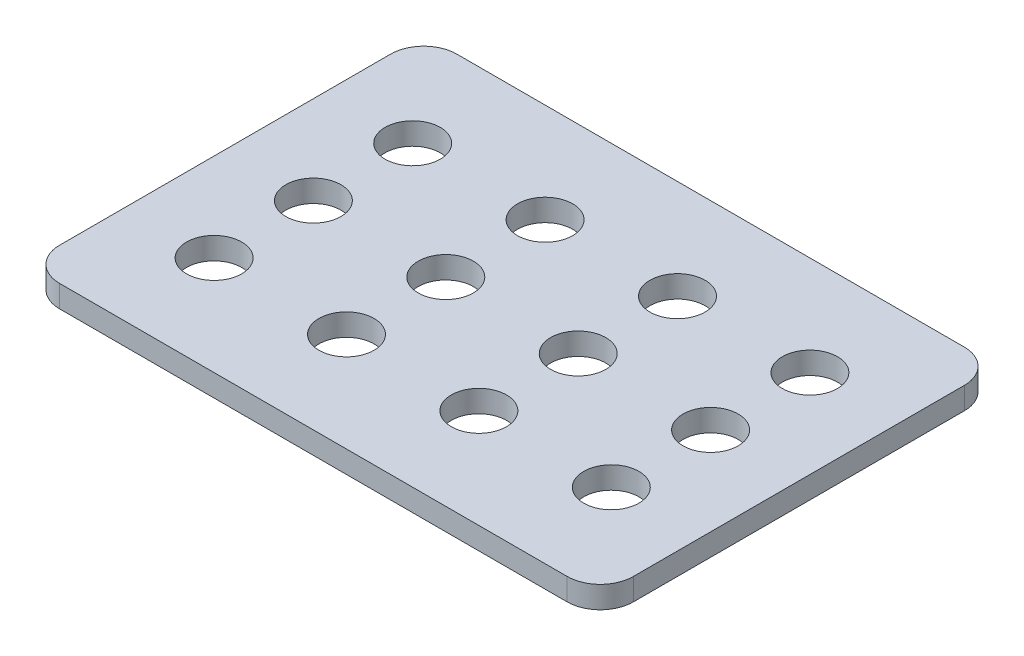
ISO-10303-21;
HEADER;
FILE_DESCRIPTION(('STEP AP214'),'2;1');
FILE_NAME('part.step','',(''),(''),'','','');
FILE_SCHEMA(('AUTOMOTIVE_DESIGN { 1 0 10303 214 1 1 1 1 }'));
ENDSEC;
DATA;
#1=APPLICATION_CONTEXT('core data for automotive mechanical design processes');
#2=APPLICATION_PROTOCOL_DEFINITION('international standard','automotive_design',2000,#1);
#3=PRODUCT_CONTEXT('',#1,'mechanical');
#4=PRODUCT('Part','Part','',(#3));
#5=PRODUCT_RELATED_PRODUCT_CATEGORY('part','',(#4));
#6=PRODUCT_DEFINITION_FORMATION('','',#4);
#7=PRODUCT_DEFINITION_CONTEXT('part definition',#1,'design');
#8=PRODUCT_DEFINITION('design','',#6,#7);
#9=PRODUCT_DEFINITION_SHAPE('','',#8);
#10=(LENGTH_UNIT() NAMED_UNIT(*) SI_UNIT(.MILLI.,.METRE.));
#11=(NAMED_UNIT(*) PLANE_ANGLE_UNIT() SI_UNIT($,.RADIAN.));
#12=(NAMED_UNIT(*) SI_UNIT($,.STERADIAN.) SOLID_ANGLE_UNIT());
#13=UNCERTAINTY_MEASURE_WITH_UNIT(LENGTH_MEASURE(1.E-05),#10,'distance_accuracy_value','');
#14=(GEOMETRIC_REPRESENTATION_CONTEXT(3) GLOBAL_UNCERTAINTY_ASSIGNED_CONTEXT((#13)) GLOBAL_UNIT_ASSIGNED_CONTEXT((#10,
#11,#12)) REPRESENTATION_CONTEXT('',''));
#15=CARTESIAN_POINT('',(0.,0.,0.));
#16=DIRECTION('',(0.,0.,1.));
#17=DIRECTION('',(1.,0.,0.));
#18=AXIS2_PLACEMENT_3D('',#15,#16,#17);
#19=CARTESIAN_POINT('',(245.,10.,-15.));
#20=DIRECTION('',(0.,1.,0.));
#21=DIRECTION('',(0.,0.,1.));
#22=AXIS2_PLACEMENT_3D('',#19,#20,#21);
#23=PLANE('',#22);
#24=CARTESIAN_POINT('',(39.9999999999995,10.,-90.));
#25=DIRECTION('',(0.,1.,0.));
#26=DIRECTION('',(0.,0.,1.));
#27=AXIS2_PLACEMENT_3D('',#24,#25,#26);
#28=CIRCLE('',#27,12.5);
#29=CARTESIAN_POINT('',(39.9999999999995,10.,-77.5));
#30=VERTEX_POINT('',#29);
#31=EDGE_CURVE('E291',#30,#30,#28,.T.);
#32=ORIENTED_EDGE('',*,*,#31,.F.);
#33=EDGE_LOOP('',(#32));
#34=FACE_BOUND('',#33,.T.);
#35=CARTESIAN_POINT('',(160.,10.,-45.));
#36=DIRECTION('',(0.,1.,0.));
#37=DIRECTION('',(0.,0.,1.));
#38=AXIS2_PLACEMENT_3D('',#35,#36,#37);
#39=CIRCLE('',#38,12.5);
#40=CARTESIAN_POINT('',(160.,10.,-32.5));
#41=VERTEX_POINT('',#40);
#42=EDGE_CURVE('E275',#41,#41,#39,.T.);
#43=ORIENTED_EDGE('',*,*,#42,.F.);
#44=EDGE_LOOP('',(#43));
#45=FACE_BOUND('',#44,.T.);
#46=CARTESIAN_POINT('',(220.,10.,-90.));
#47=DIRECTION('',(0.,1.,0.));
#48=DIRECTION('',(0.,0.,1.));
#49=AXIS2_PLACEMENT_3D('',#46,#47,#48);
#50=CIRCLE('',#49,12.5);
#51=CARTESIAN_POINT('',(220.,10.,-77.5));
#52=VERTEX_POINT('',#51);
#53=EDGE_CURVE('E259',#52,#52,#50,.T.);
#54=ORIENTED_EDGE('',*,*,#53,.F.);
#55=EDGE_LOOP('',(#54));
#56=FACE_BOUND('',#55,.T.);
#57=CARTESIAN_POINT('',(99.9999999999995,10.,-90.));
#58=DIRECTION('',(0.,1.,0.));
#59=DIRECTION('',(0.,0.,1.));
#60=AXIS2_PLACEMENT_3D('',#57,#58,#59);
#61=CIRCLE('',#60,12.5);
#62=CARTESIAN_POINT('',(99.9999999999995,10.,-77.5));
#63=VERTEX_POINT('',#62);
#64=EDGE_CURVE('E243',#63,#63,#61,.T.);
#65=ORIENTED_EDGE('',*,*,#64,.F.);
#66=EDGE_LOOP('',(#65));
#67=FACE_BOUND('',#66,.T.);
#68=CARTESIAN_POINT('',(159.999999999999,10.,-135.));
#69=DIRECTION('',(0.,1.,0.));
#70=DIRECTION('',(0.,0.,1.));
#71=AXIS2_PLACEMENT_3D('',#68,#69,#70);
#72=CIRCLE('',#71,12.5);
#73=CARTESIAN_POINT('',(159.999999999999,10.,-122.5));
#74=VERTEX_POINT('',#73);
#75=EDGE_CURVE('E227',#74,#74,#72,.T.);
#76=ORIENTED_EDGE('',*,*,#75,.F.);
#77=EDGE_LOOP('',(#76));
#78=FACE_BOUND('',#77,.T.);
#79=CARTESIAN_POINT('',(40.,10.,-135.));
#80=DIRECTION('',(0.,1.,0.));
#81=DIRECTION('',(0.,0.,1.));
#82=AXIS2_PLACEMENT_3D('',#79,#80,#81);
#83=CIRCLE('',#82,12.4999999999991);
#84=CARTESIAN_POINT('',(40.,10.,-122.500000000001));
#85=VERTEX_POINT('',#84);
#86=EDGE_CURVE('E152',#85,#85,#83,.T.);
#87=ORIENTED_EDGE('',*,*,#86,.F.);
#88=EDGE_LOOP('',(#87));
#89=FACE_BOUND('',#88,.T.);
#90=CARTESIAN_POINT('',(245.,10.,-15.));
#91=DIRECTION('',(0.,1.,0.));
#92=DIRECTION('',(0.,0.,1.));
#93=AXIS2_PLACEMENT_3D('',#90,#91,#92);
#94=CIRCLE('',#93,15.);
#95=CARTESIAN_POINT('',(245.,10.,0.));
#96=VERTEX_POINT('',#95);
#97=CARTESIAN_POINT('',(260.,10.,-15.0000000000001));
#98=VERTEX_POINT('',#97);
#99=EDGE_CURVE('E170',#96,#98,#94,.T.);
#100=ORIENTED_EDGE('',*,*,#99,.T.);
#101=DIRECTION('',(0.,0.,-1.));
#102=VECTOR('',#101,1.);
#103=CARTESIAN_POINT('',(260.,10.,-15.0000000000001));
#104=LINE('',#103,#102);
#105=CARTESIAN_POINT('',(260.,10.,-165.));
#106=VERTEX_POINT('',#105);
#107=EDGE_CURVE('E106',#98,#106,#104,.T.);
#108=ORIENTED_EDGE('',*,*,#107,.T.);
#109=CARTESIAN_POINT('',(245.,10.,-165.));
#110=DIRECTION('',(0.,1.,0.));
#111=DIRECTION('',(0.,0.,-1.));
#112=AXIS2_PLACEMENT_3D('',#109,#110,#111);
#113=CIRCLE('',#112,15.);
#114=CARTESIAN_POINT('',(245.,10.,-180.));
#115=VERTEX_POINT('',#114);
#116=EDGE_CURVE('E191',#106,#115,#113,.T.);
#117=ORIENTED_EDGE('',*,*,#116,.T.);
#118=DIRECTION('',(-1.,0.,0.));
#119=VECTOR('',#118,1.);
#120=CARTESIAN_POINT('',(15.0000000000001,10.,-180.));
#121=LINE('',#120,#119);
#122=CARTESIAN_POINT('',(15.,10.,-180.));
#123=VERTEX_POINT('',#122);
#124=EDGE_CURVE('E205',#115,#123,#121,.T.);
#125=ORIENTED_EDGE('',*,*,#124,.T.);
#126=CARTESIAN_POINT('',(15.,10.,-165.));
#127=DIRECTION('',(0.,1.,0.));
#128=DIRECTION('',(0.,0.,-1.));
#129=AXIS2_PLACEMENT_3D('',#126,#127,#128);
#130=CIRCLE('',#129,15.);
#131=CARTESIAN_POINT('',(0.,10.,-165.));
#132=VERTEX_POINT('',#131);
#133=EDGE_CURVE('E125',#123,#132,#130,.T.);
#134=ORIENTED_EDGE('',*,*,#133,.T.);
#135=DIRECTION('',(0.,0.,1.));
#136=VECTOR('',#135,1.);
#137=CARTESIAN_POINT('',(0.,10.,-15.0000000000001));
#138=LINE('',#137,#136);
#139=CARTESIAN_POINT('',(0.,10.,-15.0000000000001));
#140=VERTEX_POINT('',#139);
#141=EDGE_CURVE('E119',#132,#140,#138,.T.);
#142=ORIENTED_EDGE('',*,*,#141,.T.);
#143=CARTESIAN_POINT('',(15.,10.,-15.));
#144=DIRECTION('',(0.,1.,0.));
#145=DIRECTION('',(0.,0.,-1.));
#146=AXIS2_PLACEMENT_3D('',#143,#144,#145);
#147=CIRCLE('',#146,15.);
#148=CARTESIAN_POINT('',(15.0000000000001,10.,0.));
#149=VERTEX_POINT('',#148);
#150=EDGE_CURVE('E123',#140,#149,#147,.T.);
#151=ORIENTED_EDGE('',*,*,#150,.T.);
#152=DIRECTION('',(1.,0.,0.));
#153=VECTOR('',#152,1.);
#154=CARTESIAN_POINT('',(15.0000000000001,10.,0.));
#155=LINE('',#154,#153);
#156=EDGE_CURVE('E63',#149,#96,#155,.T.);
#157=ORIENTED_EDGE('',*,*,#156,.T.);
#158=EDGE_LOOP('',(#100,#108,#117,#125,#134,#142,#151,#157));
#159=FACE_BOUND('',#158,.T.);
#160=CARTESIAN_POINT('',(99.9999999999991,10.,-135.));
#161=DIRECTION('',(0.,1.,0.));
#162=DIRECTION('',(0.,0.,1.));
#163=AXIS2_PLACEMENT_3D('',#160,#161,#162);
#164=CIRCLE('',#163,12.5);
#165=CARTESIAN_POINT('',(99.9999999999991,10.,-122.5));
#166=VERTEX_POINT('',#165);
#167=EDGE_CURVE('E219',#166,#166,#164,.T.);
#168=ORIENTED_EDGE('',*,*,#167,.F.);
#169=EDGE_LOOP('',(#168));
#170=FACE_BOUND('',#169,.T.);
#171=CARTESIAN_POINT('',(219.999999999999,10.,-135.));
#172=DIRECTION('',(0.,1.,0.));
#173=DIRECTION('',(0.,0.,1.));
#174=AXIS2_PLACEMENT_3D('',#171,#172,#173);
#175=CIRCLE('',#174,12.5);
#176=CARTESIAN_POINT('',(219.999999999999,10.,-122.5));
#177=VERTEX_POINT('',#176);
#178=EDGE_CURVE('E235',#177,#177,#175,.T.);
#179=ORIENTED_EDGE('',*,*,#178,.F.);
#180=EDGE_LOOP('',(#179));
#181=FACE_BOUND('',#180,.T.);
#182=CARTESIAN_POINT('',(160.,10.,-90.));
#183=DIRECTION('',(0.,1.,0.));
#184=DIRECTION('',(0.,0.,1.));
#185=AXIS2_PLACEMENT_3D('',#182,#183,#184);
#186=CIRCLE('',#185,12.5);
#187=CARTESIAN_POINT('',(160.,10.,-77.5));
#188=VERTEX_POINT('',#187);
#189=EDGE_CURVE('E251',#188,#188,#186,.T.);
#190=ORIENTED_EDGE('',*,*,#189,.F.);
#191=EDGE_LOOP('',(#190));
#192=FACE_BOUND('',#191,.T.);
#193=CARTESIAN_POINT('',(100.,10.,-45.));
#194=DIRECTION('',(0.,1.,0.));
#195=DIRECTION('',(0.,0.,1.));
#196=AXIS2_PLACEMENT_3D('',#193,#194,#195);
#197=CIRCLE('',#196,12.5);
#198=CARTESIAN_POINT('',(100.,10.,-32.5));
#199=VERTEX_POINT('',#198);
#200=EDGE_CURVE('E267',#199,#199,#197,.T.);
#201=ORIENTED_EDGE('',*,*,#200,.F.);
#202=EDGE_LOOP('',(#201));
#203=FACE_BOUND('',#202,.T.);
#204=CARTESIAN_POINT('',(220.,10.,-45.));
#205=DIRECTION('',(0.,1.,0.));
#206=DIRECTION('',(0.,0.,1.));
#207=AXIS2_PLACEMENT_3D('',#204,#205,#206);
#208=CIRCLE('',#207,12.5);
#209=CARTESIAN_POINT('',(220.,10.,-32.5));
#210=VERTEX_POINT('',#209);
#211=EDGE_CURVE('E283',#210,#210,#208,.T.);
#212=ORIENTED_EDGE('',*,*,#211,.F.);
#213=EDGE_LOOP('',(#212));
#214=FACE_BOUND('',#213,.T.);
#215=CARTESIAN_POINT('',(40.,10.,-45.));
#216=DIRECTION('',(0.,1.,0.));
#217=DIRECTION('',(0.,0.,1.));
#218=AXIS2_PLACEMENT_3D('',#215,#216,#217);
#219=CIRCLE('',#218,12.5);
#220=CARTESIAN_POINT('',(40.,10.,-32.5));
#221=VERTEX_POINT('',#220);
#222=EDGE_CURVE('E299',#221,#221,#219,.T.);
#223=ORIENTED_EDGE('',*,*,#222,.F.);
#224=EDGE_LOOP('',(#223));
#225=FACE_BOUND('',#224,.T.);
#226=ADVANCED_FACE('F45',(#34,#45,#56,#67,#78,#89,#159,#170,#181,#192,#203,#214,#225),#23,.T.);
#227=CARTESIAN_POINT('',(245.,0.,-15.));
#228=DIRECTION('',(0.,1.,0.));
#229=DIRECTION('',(0.,0.,1.));
#230=AXIS2_PLACEMENT_3D('',#227,#228,#229);
#231=PLANE('',#230);
#232=CARTESIAN_POINT('',(245.,0.,-15.));
#233=DIRECTION('',(0.,1.,0.));
#234=DIRECTION('',(0.,0.,1.));
#235=AXIS2_PLACEMENT_3D('',#232,#233,#234);
#236=CIRCLE('',#235,15.);
#237=CARTESIAN_POINT('',(245.,0.,0.));
#238=VERTEX_POINT('',#237);
#239=CARTESIAN_POINT('',(260.,0.,-15.0000000000001));
#240=VERTEX_POINT('',#239);
#241=EDGE_CURVE('E147',#238,#240,#236,.T.);
#242=ORIENTED_EDGE('',*,*,#241,.F.);
#243=DIRECTION('',(1.,0.,0.));
#244=VECTOR('',#243,1.);
#245=CARTESIAN_POINT('',(15.0000000000001,0.,0.));
#246=LINE('',#245,#244);
#247=CARTESIAN_POINT('',(15.0000000000001,0.,0.));
#248=VERTEX_POINT('',#247);
#249=EDGE_CURVE('E98',#248,#238,#246,.T.);
#250=ORIENTED_EDGE('',*,*,#249,.F.);
#251=CARTESIAN_POINT('',(15.,0.,-15.));
#252=DIRECTION('',(0.,1.,0.));
#253=DIRECTION('',(0.,0.,-1.));
#254=AXIS2_PLACEMENT_3D('',#251,#252,#253);
#255=CIRCLE('',#254,15.);
#256=CARTESIAN_POINT('',(0.,0.,-15.0000000000001));
#257=VERTEX_POINT('',#256);
#258=EDGE_CURVE('E92',#257,#248,#255,.T.);
#259=ORIENTED_EDGE('',*,*,#258,.F.);
#260=DIRECTION('',(0.,0.,1.));
#261=VECTOR('',#260,1.);
#262=CARTESIAN_POINT('',(0.,0.,-15.0000000000001));
#263=LINE('',#262,#261);
#264=CARTESIAN_POINT('',(0.,0.,-165.));
#265=VERTEX_POINT('',#264);
#266=EDGE_CURVE('E134',#265,#257,#263,.T.);
#267=ORIENTED_EDGE('',*,*,#266,.F.);
#268=CARTESIAN_POINT('',(15.,0.,-165.));
#269=DIRECTION('',(0.,1.,0.));
#270=DIRECTION('',(0.,0.,-1.));
#271=AXIS2_PLACEMENT_3D('',#268,#269,#270);
#272=CIRCLE('',#271,15.);
#273=CARTESIAN_POINT('',(15.,0.,-180.));
#274=VERTEX_POINT('',#273);
#275=EDGE_CURVE('E161',#274,#265,#272,.T.);
#276=ORIENTED_EDGE('',*,*,#275,.F.);
#277=DIRECTION('',(-1.,0.,0.));
#278=VECTOR('',#277,1.);
#279=CARTESIAN_POINT('',(15.0000000000001,0.,-180.));
#280=LINE('',#279,#278);
#281=CARTESIAN_POINT('',(245.,0.,-180.));
#282=VERTEX_POINT('',#281);
#283=EDGE_CURVE('E158',#282,#274,#280,.T.);
#284=ORIENTED_EDGE('',*,*,#283,.F.);
#285=CARTESIAN_POINT('',(245.,0.,-165.));
#286=DIRECTION('',(0.,1.,0.));
#287=DIRECTION('',(0.,0.,-1.));
#288=AXIS2_PLACEMENT_3D('',#285,#286,#287);
#289=CIRCLE('',#288,15.);
#290=CARTESIAN_POINT('',(260.,0.,-165.));
#291=VERTEX_POINT('',#290);
#292=EDGE_CURVE('E155',#291,#282,#289,.T.);
#293=ORIENTED_EDGE('',*,*,#292,.F.);
#294=DIRECTION('',(0.,0.,-1.));
#295=VECTOR('',#294,1.);
#296=CARTESIAN_POINT('',(260.,0.,-15.0000000000001));
#297=LINE('',#296,#295);
#298=EDGE_CURVE('E151',#240,#291,#297,.T.);
#299=ORIENTED_EDGE('',*,*,#298,.F.);
#300=EDGE_LOOP('',(#242,#250,#259,#267,#276,#284,#293,#299));
#301=FACE_BOUND('',#300,.T.);
#302=CARTESIAN_POINT('',(40.,0.,-135.));
#303=DIRECTION('',(0.,1.,0.));
#304=DIRECTION('',(0.,0.,1.));
#305=AXIS2_PLACEMENT_3D('',#302,#303,#304);
#306=CIRCLE('',#305,12.4999999999991);
#307=CARTESIAN_POINT('',(40.,0.,-122.500000000001));
#308=VERTEX_POINT('',#307);
#309=EDGE_CURVE('E215',#308,#308,#306,.T.);
#310=ORIENTED_EDGE('',*,*,#309,.T.);
#311=EDGE_LOOP('',(#310));
#312=FACE_BOUND('',#311,.T.);
#313=CARTESIAN_POINT('',(99.9999999999991,0.,-135.));
#314=DIRECTION('',(0.,1.,0.));
#315=DIRECTION('',(0.,0.,1.));
#316=AXIS2_PLACEMENT_3D('',#313,#314,#315);
#317=CIRCLE('',#316,12.5);
#318=CARTESIAN_POINT('',(99.9999999999991,0.,-122.5));
#319=VERTEX_POINT('',#318);
#320=EDGE_CURVE('E223',#319,#319,#317,.T.);
#321=ORIENTED_EDGE('',*,*,#320,.T.);
#322=EDGE_LOOP('',(#321));
#323=FACE_BOUND('',#322,.T.);
#324=CARTESIAN_POINT('',(159.999999999999,0.,-135.));
#325=DIRECTION('',(0.,1.,0.));
#326=DIRECTION('',(0.,0.,1.));
#327=AXIS2_PLACEMENT_3D('',#324,#325,#326);
#328=CIRCLE('',#327,12.5);
#329=CARTESIAN_POINT('',(159.999999999999,0.,-122.5));
#330=VERTEX_POINT('',#329);
#331=EDGE_CURVE('E231',#330,#330,#328,.T.);
#332=ORIENTED_EDGE('',*,*,#331,.T.);
#333=EDGE_LOOP('',(#332));
#334=FACE_BOUND('',#333,.T.);
#335=CARTESIAN_POINT('',(219.999999999999,0.,-135.));
#336=DIRECTION('',(0.,1.,0.));
#337=DIRECTION('',(0.,0.,1.));
#338=AXIS2_PLACEMENT_3D('',#335,#336,#337);
#339=CIRCLE('',#338,12.5);
#340=CARTESIAN_POINT('',(219.999999999999,0.,-122.5));
#341=VERTEX_POINT('',#340);
#342=EDGE_CURVE('E239',#341,#341,#339,.T.);
#343=ORIENTED_EDGE('',*,*,#342,.T.);
#344=EDGE_LOOP('',(#343));
#345=FACE_BOUND('',#344,.T.);
#346=CARTESIAN_POINT('',(99.9999999999995,0.,-90.));
#347=DIRECTION('',(0.,1.,0.));
#348=DIRECTION('',(0.,0.,1.));
#349=AXIS2_PLACEMENT_3D('',#346,#347,#348);
#350=CIRCLE('',#349,12.5);
#351=CARTESIAN_POINT('',(99.9999999999995,0.,-77.5));
#352=VERTEX_POINT('',#351);
#353=EDGE_CURVE('E247',#352,#352,#350,.T.);
#354=ORIENTED_EDGE('',*,*,#353,.T.);
#355=EDGE_LOOP('',(#354));
#356=FACE_BOUND('',#355,.T.);
#357=CARTESIAN_POINT('',(160.,0.,-90.));
#358=DIRECTION('',(0.,1.,0.));
#359=DIRECTION('',(0.,0.,1.));
#360=AXIS2_PLACEMENT_3D('',#357,#358,#359);
#361=CIRCLE('',#360,12.5);
#362=CARTESIAN_POINT('',(160.,0.,-77.5));
#363=VERTEX_POINT('',#362);
#364=EDGE_CURVE('E255',#363,#363,#361,.T.);
#365=ORIENTED_EDGE('',*,*,#364,.T.);
#366=EDGE_LOOP('',(#365));
#367=FACE_BOUND('',#366,.T.);
#368=CARTESIAN_POINT('',(220.,0.,-90.));
#369=DIRECTION('',(0.,1.,0.));
#370=DIRECTION('',(0.,0.,1.));
#371=AXIS2_PLACEMENT_3D('',#368,#369,#370);
#372=CIRCLE('',#371,12.5);
#373=CARTESIAN_POINT('',(220.,0.,-77.5));
#374=VERTEX_POINT('',#373);
#375=EDGE_CURVE('E263',#374,#374,#372,.T.);
#376=ORIENTED_EDGE('',*,*,#375,.T.);
#377=EDGE_LOOP('',(#376));
#378=FACE_BOUND('',#377,.T.);
#379=CARTESIAN_POINT('',(100.,0.,-45.));
#380=DIRECTION('',(0.,1.,0.));
#381=DIRECTION('',(0.,0.,1.));
#382=AXIS2_PLACEMENT_3D('',#379,#380,#381);
#383=CIRCLE('',#382,12.5);
#384=CARTESIAN_POINT('',(100.,0.,-32.5));
#385=VERTEX_POINT('',#384);
#386=EDGE_CURVE('E271',#385,#385,#383,.T.);
#387=ORIENTED_EDGE('',*,*,#386,.T.);
#388=EDGE_LOOP('',(#387));
#389=FACE_BOUND('',#388,.T.);
#390=CARTESIAN_POINT('',(160.,0.,-45.));
#391=DIRECTION('',(0.,1.,0.));
#392=DIRECTION('',(0.,0.,1.));
#393=AXIS2_PLACEMENT_3D('',#390,#391,#392);
#394=CIRCLE('',#393,12.5);
#395=CARTESIAN_POINT('',(160.,0.,-32.5));
#396=VERTEX_POINT('',#395);
#397=EDGE_CURVE('E279',#396,#396,#394,.T.);
#398=ORIENTED_EDGE('',*,*,#397,.T.);
#399=EDGE_LOOP('',(#398));
#400=FACE_BOUND('',#399,.T.);
#401=CARTESIAN_POINT('',(220.,0.,-45.));
#402=DIRECTION('',(0.,1.,0.));
#403=DIRECTION('',(0.,0.,1.));
#404=AXIS2_PLACEMENT_3D('',#401,#402,#403);
#405=CIRCLE('',#404,12.5);
#406=CARTESIAN_POINT('',(220.,0.,-32.5));
#407=VERTEX_POINT('',#406);
#408=EDGE_CURVE('E287',#407,#407,#405,.T.);
#409=ORIENTED_EDGE('',*,*,#408,.T.);
#410=EDGE_LOOP('',(#409));
#411=FACE_BOUND('',#410,.T.);
#412=CARTESIAN_POINT('',(39.9999999999995,0.,-90.));
#413=DIRECTION('',(0.,1.,0.));
#414=DIRECTION('',(0.,0.,1.));
#415=AXIS2_PLACEMENT_3D('',#412,#413,#414);
#416=CIRCLE('',#415,12.5);
#417=CARTESIAN_POINT('',(39.9999999999995,0.,-77.5));
#418=VERTEX_POINT('',#417);
#419=EDGE_CURVE('E295',#418,#418,#416,.T.);
#420=ORIENTED_EDGE('',*,*,#419,.T.);
#421=EDGE_LOOP('',(#420));
#422=FACE_BOUND('',#421,.T.);
#423=CARTESIAN_POINT('',(40.,0.,-45.));
#424=DIRECTION('',(0.,1.,0.));
#425=DIRECTION('',(0.,0.,1.));
#426=AXIS2_PLACEMENT_3D('',#423,#424,#425);
#427=CIRCLE('',#426,12.5);
#428=CARTESIAN_POINT('',(40.,0.,-32.5));
#429=VERTEX_POINT('',#428);
#430=EDGE_CURVE('E303',#429,#429,#427,.T.);
#431=ORIENTED_EDGE('',*,*,#430,.T.);
#432=EDGE_LOOP('',(#431));
#433=FACE_BOUND('',#432,.T.);
#434=ADVANCED_FACE('F195',(#301,#312,#323,#334,#345,#356,#367,#378,#389,#400,#411,#422,#433),
#231,.F.);
#435=CARTESIAN_POINT('',(245.,10.,-15.));
#436=DIRECTION('',(0.,-1.,0.));
#437=DIRECTION('',(0.,0.,-1.));
#438=AXIS2_PLACEMENT_3D('',#435,#436,#437);
#439=CYLINDRICAL_SURFACE('',#438,15.);
#440=ORIENTED_EDGE('',*,*,#241,.T.);
#441=DIRECTION('',(0.,-1.,0.));
#442=VECTOR('',#441,1.);
#443=CARTESIAN_POINT('',(260.,10.,-15.0000000000001));
#444=LINE('',#443,#442);
#445=EDGE_CURVE('E11',#98,#240,#444,.T.);
#446=ORIENTED_EDGE('',*,*,#445,.F.);
#447=ORIENTED_EDGE('',*,*,#99,.F.);
#448=DIRECTION('',(0.,-1.,0.));
#449=VECTOR('',#448,1.);
#450=CARTESIAN_POINT('',(245.,10.,0.));
#451=LINE('',#450,#449);
#452=EDGE_CURVE('E143',#96,#238,#451,.T.);
#453=ORIENTED_EDGE('',*,*,#452,.T.);
#454=EDGE_LOOP('',(#440,#446,#447,#453));
#455=FACE_BOUND('',#454,.T.);
#456=ADVANCED_FACE('F47',(#455),#439,.T.);
#457=CARTESIAN_POINT('',(260.,10.,-15.0000000000001));
#458=DIRECTION('',(-1.,0.,0.));
#459=DIRECTION('',(0.,0.,1.));
#460=AXIS2_PLACEMENT_3D('',#457,#458,#459);
#461=PLANE('',#460);
#462=ORIENTED_EDGE('',*,*,#298,.T.);
#463=DIRECTION('',(0.,-1.,0.));
#464=VECTOR('',#463,1.);
#465=CARTESIAN_POINT('',(260.,10.,-165.));
#466=LINE('',#465,#464);
#467=EDGE_CURVE('E55',#106,#291,#466,.T.);
#468=ORIENTED_EDGE('',*,*,#467,.F.);
#469=ORIENTED_EDGE('',*,*,#107,.F.);
#470=ORIENTED_EDGE('',*,*,#445,.T.);
#471=EDGE_LOOP('',(#462,#468,#469,#470));
#472=FACE_BOUND('',#471,.T.);
#473=ADVANCED_FACE('F339',(#472),#461,.F.);
#474=CARTESIAN_POINT('',(245.,10.,-165.));
#475=DIRECTION('',(0.,-1.,0.));
#476=DIRECTION('',(0.,0.,-1.));
#477=AXIS2_PLACEMENT_3D('',#474,#475,#476);
#478=CYLINDRICAL_SURFACE('',#477,15.);
#479=ORIENTED_EDGE('',*,*,#292,.T.);
#480=DIRECTION('',(0.,-1.,0.));
#481=VECTOR('',#480,1.);
#482=CARTESIAN_POINT('',(245.,10.,-180.));
#483=LINE('',#482,#481);
#484=EDGE_CURVE('E181',#115,#282,#483,.T.);
#485=ORIENTED_EDGE('',*,*,#484,.F.);
#486=ORIENTED_EDGE('',*,*,#116,.F.);
#487=ORIENTED_EDGE('',*,*,#467,.T.);
#488=EDGE_LOOP('',(#479,#485,#486,#487));
#489=FACE_BOUND('',#488,.T.);
#490=ADVANCED_FACE('F189',(#489),#478,.T.);
#491=CARTESIAN_POINT('',(15.0000000000001,10.,-180.));
#492=DIRECTION('',(0.,0.,1.));
#493=DIRECTION('',(1.,0.,0.));
#494=AXIS2_PLACEMENT_3D('',#491,#492,#493);
#495=PLANE('',#494);
#496=ORIENTED_EDGE('',*,*,#283,.T.);
#497=DIRECTION('',(0.,-1.,0.));
#498=VECTOR('',#497,1.);
#499=CARTESIAN_POINT('',(15.,10.,-180.));
#500=LINE('',#499,#498);
#501=EDGE_CURVE('E177',#123,#274,#500,.T.);
#502=ORIENTED_EDGE('',*,*,#501,.F.);
#503=ORIENTED_EDGE('',*,*,#124,.F.);
#504=ORIENTED_EDGE('',*,*,#484,.T.);
#505=EDGE_LOOP('',(#496,#502,#503,#504));
#506=FACE_BOUND('',#505,.T.);
#507=ADVANCED_FACE('F200',(#506),#495,.F.);
#508=CARTESIAN_POINT('',(15.,10.,-165.));
#509=DIRECTION('',(0.,-1.,0.));
#510=DIRECTION('',(0.,0.,-1.));
#511=AXIS2_PLACEMENT_3D('',#508,#509,#510);
#512=CYLINDRICAL_SURFACE('',#511,15.);
#513=ORIENTED_EDGE('',*,*,#275,.T.);
#514=DIRECTION('',(0.,-1.,0.));
#515=VECTOR('',#514,1.);
#516=CARTESIAN_POINT('',(0.,10.,-165.));
#517=LINE('',#516,#515);
#518=EDGE_CURVE('E136',#132,#265,#517,.T.);
#519=ORIENTED_EDGE('',*,*,#518,.F.);
#520=ORIENTED_EDGE('',*,*,#133,.F.);
#521=ORIENTED_EDGE('',*,*,#501,.T.);
#522=EDGE_LOOP('',(#513,#519,#520,#521));
#523=FACE_BOUND('',#522,.T.);
#524=ADVANCED_FACE('F203',(#523),#512,.T.);
#525=CARTESIAN_POINT('',(0.,10.,-15.0000000000001));
#526=DIRECTION('',(1.,0.,0.));
#527=DIRECTION('',(0.,0.,-1.));
#528=AXIS2_PLACEMENT_3D('',#525,#526,#527);
#529=PLANE('',#528);
#530=ORIENTED_EDGE('',*,*,#266,.T.);
#531=DIRECTION('',(0.,-1.,0.));
#532=VECTOR('',#531,1.);
#533=CARTESIAN_POINT('',(0.,10.,-15.0000000000001));
#534=LINE('',#533,#532);
#535=EDGE_CURVE('E131',#140,#257,#534,.T.);
#536=ORIENTED_EDGE('',*,*,#535,.F.);
#537=ORIENTED_EDGE('',*,*,#141,.F.);
#538=ORIENTED_EDGE('',*,*,#518,.T.);
#539=EDGE_LOOP('',(#530,#536,#537,#538));
#540=FACE_BOUND('',#539,.T.);
#541=ADVANCED_FACE('F132',(#540),#529,.F.);
#542=CARTESIAN_POINT('',(15.,10.,-15.));
#543=DIRECTION('',(0.,-1.,0.));
#544=DIRECTION('',(0.,0.,-1.));
#545=AXIS2_PLACEMENT_3D('',#542,#543,#544);
#546=CYLINDRICAL_SURFACE('',#545,15.);
#547=ORIENTED_EDGE('',*,*,#258,.T.);
#548=DIRECTION('',(0.,-1.,0.));
#549=VECTOR('',#548,1.);
#550=CARTESIAN_POINT('',(15.0000000000001,10.,0.));
#551=LINE('',#550,#549);
#552=EDGE_CURVE('E137',#149,#248,#551,.T.);
#553=ORIENTED_EDGE('',*,*,#552,.F.);
#554=ORIENTED_EDGE('',*,*,#150,.F.);
#555=ORIENTED_EDGE('',*,*,#535,.T.);
#556=EDGE_LOOP('',(#547,#553,#554,#555));
#557=FACE_BOUND('',#556,.T.);
#558=ADVANCED_FACE('F139',(#557),#546,.T.);
#559=CARTESIAN_POINT('',(15.0000000000001,10.,0.));
#560=DIRECTION('',(0.,0.,-1.));
#561=DIRECTION('',(-1.,0.,0.));
#562=AXIS2_PLACEMENT_3D('',#559,#560,#561);
#563=PLANE('',#562);
#564=ORIENTED_EDGE('',*,*,#249,.T.);
#565=ORIENTED_EDGE('',*,*,#452,.F.);
#566=ORIENTED_EDGE('',*,*,#156,.F.);
#567=ORIENTED_EDGE('',*,*,#552,.T.);
#568=EDGE_LOOP('',(#564,#565,#566,#567));
#569=FACE_BOUND('',#568,.T.);
#570=ADVANCED_FACE('F327',(#569),#563,.F.);
#571=CARTESIAN_POINT('',(40.,10.,-135.));
#572=DIRECTION('',(0.,-1.,0.));
#573=DIRECTION('',(0.,0.,-1.));
#574=AXIS2_PLACEMENT_3D('',#571,#572,#573);
#575=CYLINDRICAL_SURFACE('',#574,12.4999999999991);
#576=ORIENTED_EDGE('',*,*,#86,.T.);
#577=EDGE_LOOP('',(#576));
#578=FACE_BOUND('',#577,.T.);
#579=ORIENTED_EDGE('',*,*,#309,.F.);
#580=EDGE_LOOP('',(#579));
#581=FACE_BOUND('',#580,.T.);
#582=ADVANCED_FACE('F324',(#578,#581),#575,.F.);
#583=CARTESIAN_POINT('',(99.9999999999991,10.,-135.));
#584=DIRECTION('',(0.,-1.,0.));
#585=DIRECTION('',(0.,0.,-1.));
#586=AXIS2_PLACEMENT_3D('',#583,#584,#585);
#587=CYLINDRICAL_SURFACE('',#586,12.5);
#588=ORIENTED_EDGE('',*,*,#167,.T.);
#589=EDGE_LOOP('',(#588));
#590=FACE_BOUND('',#589,.T.);
#591=ORIENTED_EDGE('',*,*,#320,.F.);
#592=EDGE_LOOP('',(#591));
#593=FACE_BOUND('',#592,.T.);
#594=ADVANCED_FACE('F402',(#590,#593),#587,.F.);
#595=CARTESIAN_POINT('',(159.999999999999,10.,-135.));
#596=DIRECTION('',(0.,-1.,0.));
#597=DIRECTION('',(0.,0.,-1.));
#598=AXIS2_PLACEMENT_3D('',#595,#596,#597);
#599=CYLINDRICAL_SURFACE('',#598,12.5);
#600=ORIENTED_EDGE('',*,*,#75,.T.);
#601=EDGE_LOOP('',(#600));
#602=FACE_BOUND('',#601,.T.);
#603=ORIENTED_EDGE('',*,*,#331,.F.);
#604=EDGE_LOOP('',(#603));
#605=FACE_BOUND('',#604,.T.);
#606=ADVANCED_FACE('F410',(#602,#605),#599,.F.);
#607=CARTESIAN_POINT('',(219.999999999999,10.,-135.));
#608=DIRECTION('',(0.,-1.,0.));
#609=DIRECTION('',(0.,0.,-1.));
#610=AXIS2_PLACEMENT_3D('',#607,#608,#609);
#611=CYLINDRICAL_SURFACE('',#610,12.5);
#612=ORIENTED_EDGE('',*,*,#178,.T.);
#613=EDGE_LOOP('',(#612));
#614=FACE_BOUND('',#613,.T.);
#615=ORIENTED_EDGE('',*,*,#342,.F.);
#616=EDGE_LOOP('',(#615));
#617=FACE_BOUND('',#616,.T.);
#618=ADVANCED_FACE('F418',(#614,#617),#611,.F.);
#619=CARTESIAN_POINT('',(99.9999999999995,10.,-90.));
#620=DIRECTION('',(0.,-1.,0.));
#621=DIRECTION('',(0.,0.,-1.));
#622=AXIS2_PLACEMENT_3D('',#619,#620,#621);
#623=CYLINDRICAL_SURFACE('',#622,12.5);
#624=ORIENTED_EDGE('',*,*,#64,.T.);
#625=EDGE_LOOP('',(#624));
#626=FACE_BOUND('',#625,.T.);
#627=ORIENTED_EDGE('',*,*,#353,.F.);
#628=EDGE_LOOP('',(#627));
#629=FACE_BOUND('',#628,.T.);
#630=ADVANCED_FACE('F427',(#626,#629),#623,.F.);
#631=CARTESIAN_POINT('',(160.,10.,-90.));
#632=DIRECTION('',(0.,-1.,0.));
#633=DIRECTION('',(0.,0.,-1.));
#634=AXIS2_PLACEMENT_3D('',#631,#632,#633);
#635=CYLINDRICAL_SURFACE('',#634,12.5);
#636=ORIENTED_EDGE('',*,*,#189,.T.);
#637=EDGE_LOOP('',(#636));
#638=FACE_BOUND('',#637,.T.);
#639=ORIENTED_EDGE('',*,*,#364,.F.);
#640=EDGE_LOOP('',(#639));
#641=FACE_BOUND('',#640,.T.);
#642=ADVANCED_FACE('F436',(#638,#641),#635,.F.);
#643=CARTESIAN_POINT('',(220.,10.,-90.));
#644=DIRECTION('',(0.,-1.,0.));
#645=DIRECTION('',(0.,0.,-1.));
#646=AXIS2_PLACEMENT_3D('',#643,#644,#645);
#647=CYLINDRICAL_SURFACE('',#646,12.5);
#648=ORIENTED_EDGE('',*,*,#53,.T.);
#649=EDGE_LOOP('',(#648));
#650=FACE_BOUND('',#649,.T.);
#651=ORIENTED_EDGE('',*,*,#375,.F.);
#652=EDGE_LOOP('',(#651));
#653=FACE_BOUND('',#652,.T.);
#654=ADVANCED_FACE('F445',(#650,#653),#647,.F.);
#655=CARTESIAN_POINT('',(100.,10.,-45.));
#656=DIRECTION('',(0.,-1.,0.));
#657=DIRECTION('',(0.,0.,-1.));
#658=AXIS2_PLACEMENT_3D('',#655,#656,#657);
#659=CYLINDRICAL_SURFACE('',#658,12.5);
#660=ORIENTED_EDGE('',*,*,#200,.T.);
#661=EDGE_LOOP('',(#660));
#662=FACE_BOUND('',#661,.T.);
#663=ORIENTED_EDGE('',*,*,#386,.F.);
#664=EDGE_LOOP('',(#663));
#665=FACE_BOUND('',#664,.T.);
#666=ADVANCED_FACE('F454',(#662,#665),#659,.F.);
#667=CARTESIAN_POINT('',(160.,10.,-45.));
#668=DIRECTION('',(0.,-1.,0.));
#669=DIRECTION('',(0.,0.,-1.));
#670=AXIS2_PLACEMENT_3D('',#667,#668,#669);
#671=CYLINDRICAL_SURFACE('',#670,12.5);
#672=ORIENTED_EDGE('',*,*,#42,.T.);
#673=EDGE_LOOP('',(#672));
#674=FACE_BOUND('',#673,.T.);
#675=ORIENTED_EDGE('',*,*,#397,.F.);
#676=EDGE_LOOP('',(#675));
#677=FACE_BOUND('',#676,.T.);
#678=ADVANCED_FACE('F463',(#674,#677),#671,.F.);
#679=CARTESIAN_POINT('',(220.,10.,-45.));
#680=DIRECTION('',(0.,-1.,0.));
#681=DIRECTION('',(0.,0.,-1.));
#682=AXIS2_PLACEMENT_3D('',#679,#680,#681);
#683=CYLINDRICAL_SURFACE('',#682,12.5);
#684=ORIENTED_EDGE('',*,*,#211,.T.);
#685=EDGE_LOOP('',(#684));
#686=FACE_BOUND('',#685,.T.);
#687=ORIENTED_EDGE('',*,*,#408,.F.);
#688=EDGE_LOOP('',(#687));
#689=FACE_BOUND('',#688,.T.);
#690=ADVANCED_FACE('F472',(#686,#689),#683,.F.);
#691=CARTESIAN_POINT('',(39.9999999999995,10.,-90.));
#692=DIRECTION('',(0.,-1.,0.));
#693=DIRECTION('',(0.,0.,-1.));
#694=AXIS2_PLACEMENT_3D('',#691,#692,#693);
#695=CYLINDRICAL_SURFACE('',#694,12.5);
#696=ORIENTED_EDGE('',*,*,#31,.T.);
#697=EDGE_LOOP('',(#696));
#698=FACE_BOUND('',#697,.T.);
#699=ORIENTED_EDGE('',*,*,#419,.F.);
#700=EDGE_LOOP('',(#699));
#701=FACE_BOUND('',#700,.T.);
#702=ADVANCED_FACE('F481',(#698,#701),#695,.F.);
#703=CARTESIAN_POINT('',(40.,10.,-45.));
#704=DIRECTION('',(0.,-1.,0.));
#705=DIRECTION('',(0.,0.,-1.));
#706=AXIS2_PLACEMENT_3D('',#703,#704,#705);
#707=CYLINDRICAL_SURFACE('',#706,12.5);
#708=ORIENTED_EDGE('',*,*,#222,.T.);
#709=EDGE_LOOP('',(#708));
#710=FACE_BOUND('',#709,.T.);
#711=ORIENTED_EDGE('',*,*,#430,.F.);
#712=EDGE_LOOP('',(#711));
#713=FACE_BOUND('',#712,.T.);
#714=ADVANCED_FACE('F311',(#710,#713),#707,.F.);
#715=CLOSED_SHELL('',(#226,#434,#456,#473,#490,#507,#524,#541,#558,#570,#582,#594,#606,#618,
#630,#642,#654,#666,#678,#690,#702,#714));
#716=MANIFOLD_SOLID_BREP('B2',#715);
#717=ADVANCED_BREP_SHAPE_REPRESENTATION('',(#18,#716),#14);
#718=SHAPE_DEFINITION_REPRESENTATION(#9,#717);
ENDSEC;
END-ISO-10303-21;
